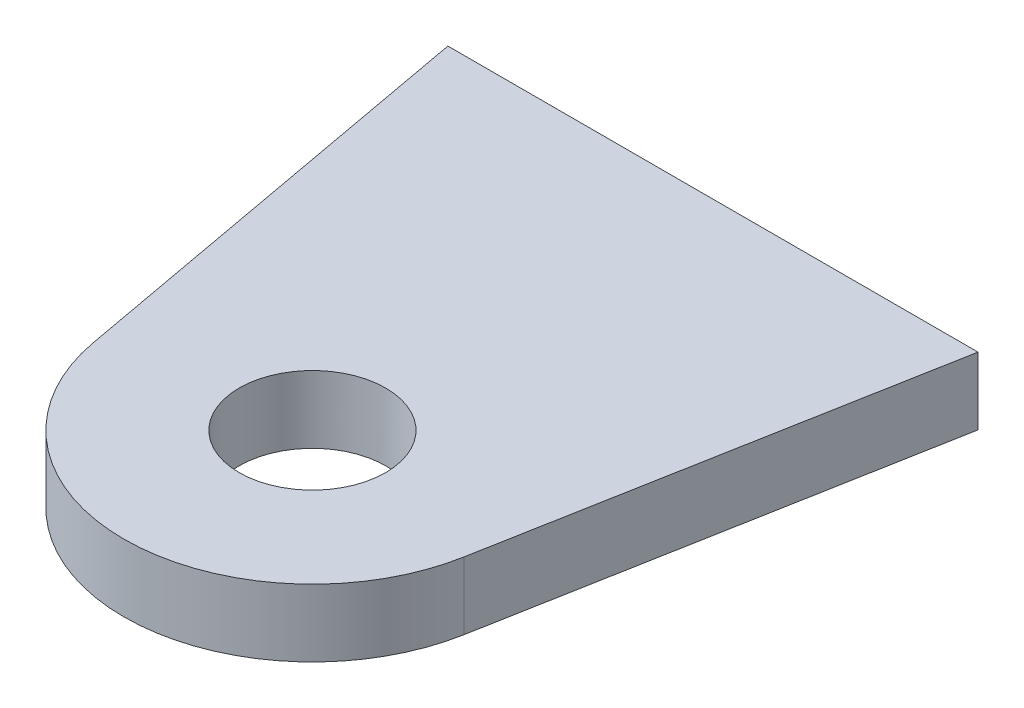
ISO-10303-21;
HEADER;
FILE_DESCRIPTION(('STEP AP214'),'2;1');
FILE_NAME('part.step','',(''),(''),'','','');
FILE_SCHEMA(('AUTOMOTIVE_DESIGN { 1 0 10303 214 1 1 1 1 }'));
ENDSEC;
DATA;
#1=APPLICATION_CONTEXT('core data for automotive mechanical design processes');
#2=APPLICATION_PROTOCOL_DEFINITION('international standard','automotive_design',2000,#1);
#3=PRODUCT_CONTEXT('',#1,'mechanical');
#4=PRODUCT('Part','Part','',(#3));
#5=PRODUCT_RELATED_PRODUCT_CATEGORY('part','',(#4));
#6=PRODUCT_DEFINITION_FORMATION('','',#4);
#7=PRODUCT_DEFINITION_CONTEXT('part definition',#1,'design');
#8=PRODUCT_DEFINITION('design','',#6,#7);
#9=PRODUCT_DEFINITION_SHAPE('','',#8);
#10=(LENGTH_UNIT() NAMED_UNIT(*) SI_UNIT(.MILLI.,.METRE.));
#11=(NAMED_UNIT(*) PLANE_ANGLE_UNIT() SI_UNIT($,.RADIAN.));
#12=(NAMED_UNIT(*) SI_UNIT($,.STERADIAN.) SOLID_ANGLE_UNIT());
#13=UNCERTAINTY_MEASURE_WITH_UNIT(LENGTH_MEASURE(1.E-05),#10,'distance_accuracy_value','');
#14=(GEOMETRIC_REPRESENTATION_CONTEXT(3) GLOBAL_UNCERTAINTY_ASSIGNED_CONTEXT((#13)) GLOBAL_UNIT_ASSIGNED_CONTEXT((#10,
#11,#12)) REPRESENTATION_CONTEXT('',''));
#15=CARTESIAN_POINT('',(0.,0.,0.));
#16=DIRECTION('',(0.,0.,1.));
#17=DIRECTION('',(1.,0.,0.));
#18=AXIS2_PLACEMENT_3D('',#15,#16,#17);
#19=CARTESIAN_POINT('',(15.1384,1.8161,0.));
#20=DIRECTION('',(0.,0.,1.));
#21=DIRECTION('',(1.,0.,0.));
#22=AXIS2_PLACEMENT_3D('',#19,#20,#21);
#23=PLANE('',#22);
#24=DIRECTION('',(-1.,0.,0.));
#25=VECTOR('',#24,1.);
#26=CARTESIAN_POINT('',(15.1384,-1.8161,0.));
#27=LINE('',#26,#25);
#28=CARTESIAN_POINT('',(29.4259,-1.8161,0.));
#29=VERTEX_POINT('',#28);
#30=CARTESIAN_POINT('',(0.850899999999998,-1.8161,0.));
#31=VERTEX_POINT('',#30);
#32=EDGE_CURVE('E55',#29,#31,#27,.T.);
#33=ORIENTED_EDGE('',*,*,#32,.T.);
#34=DIRECTION('',(0.,-1.,0.));
#35=VECTOR('',#34,1.);
#36=CARTESIAN_POINT('',(0.850899999999998,1.8161,0.));
#37=LINE('',#36,#35);
#38=CARTESIAN_POINT('',(0.850899999999998,1.8161,0.));
#39=VERTEX_POINT('',#38);
#40=EDGE_CURVE('E9',#39,#31,#37,.T.);
#41=ORIENTED_EDGE('',*,*,#40,.F.);
#42=DIRECTION('',(-1.,0.,0.));
#43=VECTOR('',#42,1.);
#44=CARTESIAN_POINT('',(15.1384,1.8161,0.));
#45=LINE('',#44,#43);
#46=CARTESIAN_POINT('',(29.4259,1.8161,0.));
#47=VERTEX_POINT('',#46);
#48=EDGE_CURVE('E31',#47,#39,#45,.T.);
#49=ORIENTED_EDGE('',*,*,#48,.F.);
#50=DIRECTION('',(0.,-1.,0.));
#51=VECTOR('',#50,1.);
#52=CARTESIAN_POINT('',(29.4259,1.8161,0.));
#53=LINE('',#52,#51);
#54=EDGE_CURVE('E83',#47,#29,#53,.T.);
#55=ORIENTED_EDGE('',*,*,#54,.T.);
#56=EDGE_LOOP('',(#33,#41,#49,#55));
#57=FACE_BOUND('',#56,.T.);
#58=ADVANCED_FACE('F15',(#57),#23,.F.);
#59=CARTESIAN_POINT('',(5.14495737704918,1.8161,23.422131147541));
#60=DIRECTION('',(0.983606557377049,0.,-0.180327868852459));
#61=DIRECTION('',(-0.180327868852459,0.,-0.983606557377049));
#62=AXIS2_PLACEMENT_3D('',#59,#60,#61);
#63=PLANE('',#62);
#64=DIRECTION('',(0.180327868852459,0.,0.983606557377049));
#65=VECTOR('',#64,1.);
#66=CARTESIAN_POINT('',(5.14495737704918,-1.8161,23.422131147541));
#67=LINE('',#66,#65);
#68=CARTESIAN_POINT('',(5.14495737704918,-1.8161,23.422131147541));
#69=VERTEX_POINT('',#68);
#70=EDGE_CURVE('E71',#31,#69,#67,.T.);
#71=ORIENTED_EDGE('',*,*,#70,.T.);
#72=DIRECTION('',(0.,-1.,0.));
#73=VECTOR('',#72,1.);
#74=CARTESIAN_POINT('',(5.14495737704918,1.8161,23.422131147541));
#75=LINE('',#74,#73);
#76=CARTESIAN_POINT('',(5.14495737704918,1.8161,23.422131147541));
#77=VERTEX_POINT('',#76);
#78=EDGE_CURVE('E23',#77,#69,#75,.T.);
#79=ORIENTED_EDGE('',*,*,#78,.F.);
#80=DIRECTION('',(0.180327868852459,0.,0.983606557377049));
#81=VECTOR('',#80,1.);
#82=CARTESIAN_POINT('',(5.14495737704918,1.8161,23.422131147541));
#83=LINE('',#82,#81);
#84=EDGE_CURVE('E61',#39,#77,#83,.T.);
#85=ORIENTED_EDGE('',*,*,#84,.F.);
#86=ORIENTED_EDGE('',*,*,#40,.T.);
#87=EDGE_LOOP('',(#71,#79,#85,#86));
#88=FACE_BOUND('',#87,.T.);
#89=ADVANCED_FACE('F70',(#88),#63,.F.);
#90=CARTESIAN_POINT('',(15.1384,1.8161,21.59));
#91=DIRECTION('',(0.,-1.,0.));
#92=DIRECTION('',(0.,0.,-1.));
#93=AXIS2_PLACEMENT_3D('',#90,#91,#92);
#94=CYLINDRICAL_SURFACE('',#93,10.16);
#95=CARTESIAN_POINT('',(15.1384,-1.8161,21.59));
#96=DIRECTION('',(0.,1.,0.));
#97=DIRECTION('',(1.,0.,0.));
#98=AXIS2_PLACEMENT_3D('',#95,#96,#97);
#99=CIRCLE('',#98,10.16);
#100=CARTESIAN_POINT('',(25.1318426229508,-1.8161,23.422131147541));
#101=VERTEX_POINT('',#100);
#102=EDGE_CURVE('E48',#69,#101,#99,.T.);
#103=ORIENTED_EDGE('',*,*,#102,.T.);
#104=DIRECTION('',(0.,-1.,0.));
#105=VECTOR('',#104,1.);
#106=CARTESIAN_POINT('',(25.1318426229508,1.8161,23.422131147541));
#107=LINE('',#106,#105);
#108=CARTESIAN_POINT('',(25.1318426229508,1.8161,23.422131147541));
#109=VERTEX_POINT('',#108);
#110=EDGE_CURVE('E72',#109,#101,#107,.T.);
#111=ORIENTED_EDGE('',*,*,#110,.F.);
#112=CARTESIAN_POINT('',(15.1384,1.8161,21.59));
#113=DIRECTION('',(0.,1.,0.));
#114=DIRECTION('',(1.,0.,0.));
#115=AXIS2_PLACEMENT_3D('',#112,#113,#114);
#116=CIRCLE('',#115,10.16);
#117=EDGE_CURVE('E66',#77,#109,#116,.T.);
#118=ORIENTED_EDGE('',*,*,#117,.F.);
#119=ORIENTED_EDGE('',*,*,#78,.T.);
#120=EDGE_LOOP('',(#103,#111,#118,#119));
#121=FACE_BOUND('',#120,.T.);
#122=ADVANCED_FACE('F73',(#121),#94,.T.);
#123=CARTESIAN_POINT('',(25.1318426229508,1.8161,23.422131147541));
#124=DIRECTION('',(-0.983606557377049,0.,-0.180327868852459));
#125=DIRECTION('',(-0.180327868852459,0.,0.983606557377049));
#126=AXIS2_PLACEMENT_3D('',#123,#124,#125);
#127=PLANE('',#126);
#128=DIRECTION('',(0.180327868852459,0.,-0.983606557377049));
#129=VECTOR('',#128,1.);
#130=CARTESIAN_POINT('',(25.1318426229508,-1.8161,23.422131147541));
#131=LINE('',#130,#129);
#132=EDGE_CURVE('E90',#101,#29,#131,.T.);
#133=ORIENTED_EDGE('',*,*,#132,.T.);
#134=ORIENTED_EDGE('',*,*,#54,.F.);
#135=DIRECTION('',(0.180327868852459,0.,-0.983606557377049));
#136=VECTOR('',#135,1.);
#137=CARTESIAN_POINT('',(25.1318426229508,1.8161,23.422131147541));
#138=LINE('',#137,#136);
#139=EDGE_CURVE('E75',#109,#47,#138,.T.);
#140=ORIENTED_EDGE('',*,*,#139,.F.);
#141=ORIENTED_EDGE('',*,*,#110,.T.);
#142=EDGE_LOOP('',(#133,#134,#140,#141));
#143=FACE_BOUND('',#142,.T.);
#144=ADVANCED_FACE('F99',(#143),#127,.F.);
#145=CARTESIAN_POINT('',(15.1384,1.8161,21.59));
#146=DIRECTION('',(0.,-1.,0.));
#147=DIRECTION('',(0.,0.,-1.));
#148=AXIS2_PLACEMENT_3D('',#145,#146,#147);
#149=CYLINDRICAL_SURFACE('',#148,3.9497);
#150=CARTESIAN_POINT('',(15.1384,-1.8161,21.59));
#151=DIRECTION('',(0.,-1.,0.));
#152=DIRECTION('',(-1.,0.,0.));
#153=AXIS2_PLACEMENT_3D('',#150,#151,#152);
#154=CIRCLE('',#153,3.9497);
#155=CARTESIAN_POINT('',(11.1887,-1.8161,21.59));
#156=VERTEX_POINT('',#155);
#157=EDGE_CURVE('E93',#156,#156,#154,.T.);
#158=ORIENTED_EDGE('',*,*,#157,.T.);
#159=EDGE_LOOP('',(#158));
#160=FACE_BOUND('',#159,.T.);
#161=CARTESIAN_POINT('',(15.1384,1.8161,21.59));
#162=DIRECTION('',(0.,-1.,0.));
#163=DIRECTION('',(1.,0.,0.));
#164=AXIS2_PLACEMENT_3D('',#161,#162,#163);
#165=CIRCLE('',#164,3.9497);
#166=CARTESIAN_POINT('',(19.0881,1.8161,21.59));
#167=VERTEX_POINT('',#166);
#168=EDGE_CURVE('E77',#167,#167,#165,.T.);
#169=ORIENTED_EDGE('',*,*,#168,.F.);
#170=EDGE_LOOP('',(#169));
#171=FACE_BOUND('',#170,.T.);
#172=ADVANCED_FACE('F107',(#160,#171),#149,.F.);
#173=CARTESIAN_POINT('',(15.1384,1.8161,21.59));
#174=DIRECTION('',(0.,1.,0.));
#175=DIRECTION('',(0.,0.,1.));
#176=AXIS2_PLACEMENT_3D('',#173,#174,#175);
#177=PLANE('',#176);
#178=ORIENTED_EDGE('',*,*,#139,.T.);
#179=ORIENTED_EDGE('',*,*,#48,.T.);
#180=ORIENTED_EDGE('',*,*,#84,.T.);
#181=ORIENTED_EDGE('',*,*,#117,.T.);
#182=EDGE_LOOP('',(#178,#179,#180,#181));
#183=FACE_BOUND('',#182,.T.);
#184=ORIENTED_EDGE('',*,*,#168,.T.);
#185=EDGE_LOOP('',(#184));
#186=FACE_BOUND('',#185,.T.);
#187=ADVANCED_FACE('F63',(#183,#186),#177,.T.);
#188=CARTESIAN_POINT('',(15.1384,-1.8161,21.59));
#189=DIRECTION('',(0.,1.,0.));
#190=DIRECTION('',(0.,0.,1.));
#191=AXIS2_PLACEMENT_3D('',#188,#189,#190);
#192=PLANE('',#191);
#193=ORIENTED_EDGE('',*,*,#32,.F.);
#194=ORIENTED_EDGE('',*,*,#132,.F.);
#195=ORIENTED_EDGE('',*,*,#102,.F.);
#196=ORIENTED_EDGE('',*,*,#70,.F.);
#197=EDGE_LOOP('',(#193,#194,#195,#196));
#198=FACE_BOUND('',#197,.T.);
#199=ORIENTED_EDGE('',*,*,#157,.F.);
#200=EDGE_LOOP('',(#199));
#201=FACE_BOUND('',#200,.T.);
#202=ADVANCED_FACE('F101',(#198,#201),#192,.F.);
#203=CLOSED_SHELL('',(#58,#89,#122,#144,#172,#187,#202));
#204=MANIFOLD_SOLID_BREP('B1',#203);
#205=ADVANCED_BREP_SHAPE_REPRESENTATION('',(#18,#204),#14);
#206=SHAPE_DEFINITION_REPRESENTATION(#9,#205);
ENDSEC;
END-ISO-10303-21;
